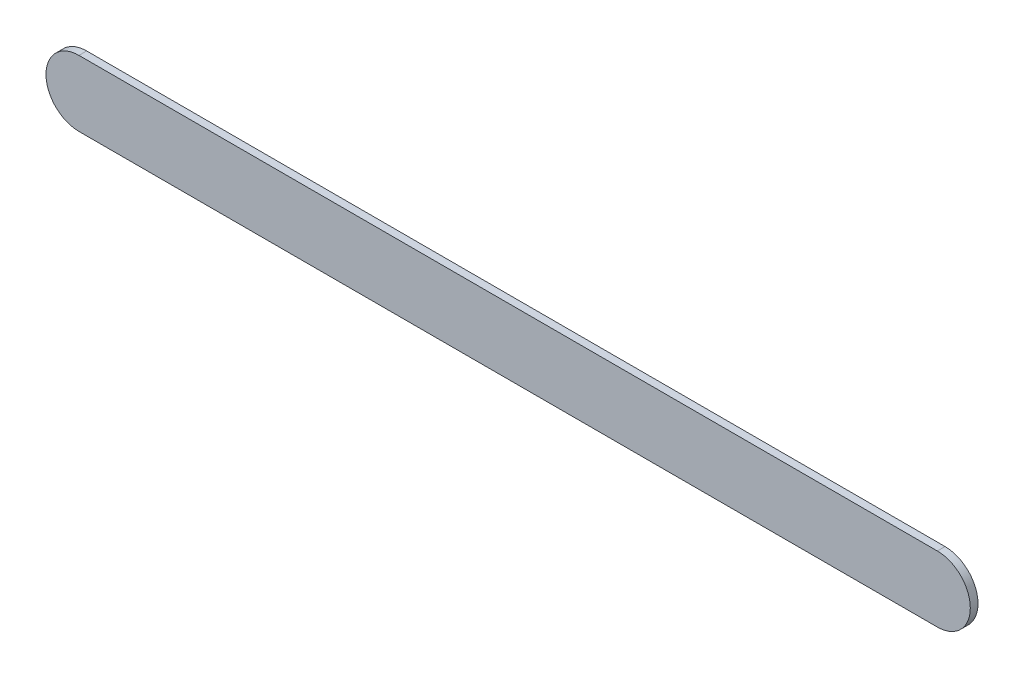
ISO-10303-21;
HEADER;
FILE_DESCRIPTION(('STEP AP214'),'2;1');
FILE_NAME('part.step','',(''),(''),'','','');
FILE_SCHEMA(('AUTOMOTIVE_DESIGN { 1 0 10303 214 1 1 1 1 }'));
ENDSEC;
DATA;
#1=APPLICATION_CONTEXT('core data for automotive mechanical design processes');
#2=APPLICATION_PROTOCOL_DEFINITION('international standard','automotive_design',2000,#1);
#3=PRODUCT_CONTEXT('',#1,'mechanical');
#4=PRODUCT('Part','Part','',(#3));
#5=PRODUCT_RELATED_PRODUCT_CATEGORY('part','',(#4));
#6=PRODUCT_DEFINITION_FORMATION('','',#4);
#7=PRODUCT_DEFINITION_CONTEXT('part definition',#1,'design');
#8=PRODUCT_DEFINITION('design','',#6,#7);
#9=PRODUCT_DEFINITION_SHAPE('','',#8);
#10=(LENGTH_UNIT() NAMED_UNIT(*) SI_UNIT(.MILLI.,.METRE.));
#11=(NAMED_UNIT(*) PLANE_ANGLE_UNIT() SI_UNIT($,.RADIAN.));
#12=(NAMED_UNIT(*) SI_UNIT($,.STERADIAN.) SOLID_ANGLE_UNIT());
#13=UNCERTAINTY_MEASURE_WITH_UNIT(LENGTH_MEASURE(1.E-05),#10,'distance_accuracy_value','');
#14=(GEOMETRIC_REPRESENTATION_CONTEXT(3) GLOBAL_UNCERTAINTY_ASSIGNED_CONTEXT((#13)) GLOBAL_UNIT_ASSIGNED_CONTEXT((#10,
#11,#12)) REPRESENTATION_CONTEXT('',''));
#15=CARTESIAN_POINT('',(0.,0.,0.));
#16=DIRECTION('',(0.,0.,1.));
#17=DIRECTION('',(1.,0.,0.));
#18=AXIS2_PLACEMENT_3D('',#15,#16,#17);
#19=CARTESIAN_POINT('',(131.4125,-67.65,1.635));
#20=DIRECTION('',(0.,0.,1.));
#21=DIRECTION('',(1.,0.,0.));
#22=AXIS2_PLACEMENT_3D('',#19,#20,#21);
#23=PLANE('',#22);
#24=DIRECTION('',(1.,0.,0.));
#25=VECTOR('',#24,1.);
#26=CARTESIAN_POINT('',(131.4125,-67.65,1.635));
#27=LINE('',#26,#25);
#28=CARTESIAN_POINT('',(131.4125,-67.65,1.635));
#29=VERTEX_POINT('',#28);
#30=CARTESIAN_POINT('',(135.32,-67.65,1.635));
#31=VERTEX_POINT('',#30);
#32=EDGE_CURVE('E84',#29,#31,#27,.T.);
#33=ORIENTED_EDGE('',*,*,#32,.T.);
#34=CARTESIAN_POINT('',(135.32,-67.5,1.635));
#35=DIRECTION('',(0.,0.,1.));
#36=DIRECTION('',(0.,-1.,0.));
#37=AXIS2_PLACEMENT_3D('',#34,#35,#36);
#38=CIRCLE('',#37,0.15);
#39=CARTESIAN_POINT('',(135.32,-67.35,1.635));
#40=VERTEX_POINT('',#39);
#41=EDGE_CURVE('E110',#31,#40,#38,.T.);
#42=ORIENTED_EDGE('',*,*,#41,.T.);
#43=DIRECTION('',(-1.,0.,0.));
#44=VECTOR('',#43,1.);
#45=CARTESIAN_POINT('',(135.32,-67.35,1.635));
#46=LINE('',#45,#44);
#47=CARTESIAN_POINT('',(131.4125,-67.35,1.635));
#48=VERTEX_POINT('',#47);
#49=EDGE_CURVE('E21',#40,#48,#46,.T.);
#50=ORIENTED_EDGE('',*,*,#49,.T.);
#51=CARTESIAN_POINT('',(131.4125,-67.5,1.635));
#52=DIRECTION('',(0.,0.,1.));
#53=DIRECTION('',(1.894780628694E-13,1.,0.));
#54=AXIS2_PLACEMENT_3D('',#51,#52,#53);
#55=CIRCLE('',#54,0.15);
#56=EDGE_CURVE('E11',#48,#29,#55,.T.);
#57=ORIENTED_EDGE('',*,*,#56,.T.);
#58=EDGE_LOOP('',(#33,#42,#50,#57));
#59=FACE_BOUND('',#58,.T.);
#60=ADVANCED_FACE('F17',(#59),#23,.T.);
#61=CARTESIAN_POINT('',(131.4125,-67.65,1.6));
#62=DIRECTION('',(0.,0.,1.));
#63=DIRECTION('',(1.,0.,0.));
#64=AXIS2_PLACEMENT_3D('',#61,#62,#63);
#65=PLANE('',#64);
#66=CARTESIAN_POINT('',(131.4125,-67.5,1.6));
#67=DIRECTION('',(0.,0.,1.));
#68=DIRECTION('',(1.894780628694E-13,1.,0.));
#69=AXIS2_PLACEMENT_3D('',#66,#67,#68);
#70=CIRCLE('',#69,0.15);
#71=CARTESIAN_POINT('',(131.4125,-67.35,1.6));
#72=VERTEX_POINT('',#71);
#73=CARTESIAN_POINT('',(131.4125,-67.65,1.6));
#74=VERTEX_POINT('',#73);
#75=EDGE_CURVE('E27',#72,#74,#70,.T.);
#76=ORIENTED_EDGE('',*,*,#75,.F.);
#77=DIRECTION('',(-1.,0.,0.));
#78=VECTOR('',#77,1.);
#79=CARTESIAN_POINT('',(135.32,-67.35,1.6));
#80=LINE('',#79,#78);
#81=CARTESIAN_POINT('',(135.32,-67.35,1.6));
#82=VERTEX_POINT('',#81);
#83=EDGE_CURVE('E106',#82,#72,#80,.T.);
#84=ORIENTED_EDGE('',*,*,#83,.F.);
#85=CARTESIAN_POINT('',(135.32,-67.5,1.6));
#86=DIRECTION('',(0.,0.,1.));
#87=DIRECTION('',(0.,-1.,0.));
#88=AXIS2_PLACEMENT_3D('',#85,#86,#87);
#89=CIRCLE('',#88,0.15);
#90=CARTESIAN_POINT('',(135.32,-67.65,1.6));
#91=VERTEX_POINT('',#90);
#92=EDGE_CURVE('E86',#91,#82,#89,.T.);
#93=ORIENTED_EDGE('',*,*,#92,.F.);
#94=DIRECTION('',(1.,0.,0.));
#95=VECTOR('',#94,1.);
#96=CARTESIAN_POINT('',(131.4125,-67.65,1.6));
#97=LINE('',#96,#95);
#98=EDGE_CURVE('E82',#74,#91,#97,.T.);
#99=ORIENTED_EDGE('',*,*,#98,.F.);
#100=EDGE_LOOP('',(#76,#84,#93,#99));
#101=FACE_BOUND('',#100,.T.);
#102=ADVANCED_FACE('F19',(#101),#65,.F.);
#103=CARTESIAN_POINT('',(131.4125,-67.5,1.6));
#104=DIRECTION('',(0.,0.,-1.));
#105=DIRECTION('',(1.894780628694E-13,1.,0.));
#106=AXIS2_PLACEMENT_3D('',#103,#104,#105);
#107=CYLINDRICAL_SURFACE('',#106,0.15);
#108=ORIENTED_EDGE('',*,*,#75,.T.);
#109=DIRECTION('',(0.,0.,1.));
#110=VECTOR('',#109,1.);
#111=CARTESIAN_POINT('',(131.4125,-67.65,1.6));
#112=LINE('',#111,#110);
#113=EDGE_CURVE('E71',#74,#29,#112,.T.);
#114=ORIENTED_EDGE('',*,*,#113,.T.);
#115=ORIENTED_EDGE('',*,*,#56,.F.);
#116=DIRECTION('',(0.,0.,1.));
#117=VECTOR('',#116,1.);
#118=CARTESIAN_POINT('',(131.4125,-67.35,1.6));
#119=LINE('',#118,#117);
#120=EDGE_CURVE('E74',#72,#48,#119,.T.);
#121=ORIENTED_EDGE('',*,*,#120,.F.);
#122=EDGE_LOOP('',(#108,#114,#115,#121));
#123=FACE_BOUND('',#122,.T.);
#124=ADVANCED_FACE('F70',(#123),#107,.T.);
#125=CARTESIAN_POINT('',(135.32,-67.35,1.6));
#126=DIRECTION('',(0.,-1.,0.));
#127=DIRECTION('',(0.,0.,-1.));
#128=AXIS2_PLACEMENT_3D('',#125,#126,#127);
#129=PLANE('',#128);
#130=ORIENTED_EDGE('',*,*,#83,.T.);
#131=ORIENTED_EDGE('',*,*,#120,.T.);
#132=ORIENTED_EDGE('',*,*,#49,.F.);
#133=DIRECTION('',(0.,0.,1.));
#134=VECTOR('',#133,1.);
#135=CARTESIAN_POINT('',(135.32,-67.35,1.6));
#136=LINE('',#135,#134);
#137=EDGE_CURVE('E103',#82,#40,#136,.T.);
#138=ORIENTED_EDGE('',*,*,#137,.F.);
#139=EDGE_LOOP('',(#130,#131,#132,#138));
#140=FACE_BOUND('',#139,.T.);
#141=ADVANCED_FACE('F118',(#140),#129,.F.);
#142=CARTESIAN_POINT('',(135.32,-67.5,1.6));
#143=DIRECTION('',(0.,0.,-1.));
#144=DIRECTION('',(0.,-1.,0.));
#145=AXIS2_PLACEMENT_3D('',#142,#143,#144);
#146=CYLINDRICAL_SURFACE('',#145,0.15);
#147=ORIENTED_EDGE('',*,*,#92,.T.);
#148=ORIENTED_EDGE('',*,*,#137,.T.);
#149=ORIENTED_EDGE('',*,*,#41,.F.);
#150=DIRECTION('',(0.,0.,1.));
#151=VECTOR('',#150,1.);
#152=CARTESIAN_POINT('',(135.32,-67.65,1.6));
#153=LINE('',#152,#151);
#154=EDGE_CURVE('E91',#91,#31,#153,.T.);
#155=ORIENTED_EDGE('',*,*,#154,.F.);
#156=EDGE_LOOP('',(#147,#148,#149,#155));
#157=FACE_BOUND('',#156,.T.);
#158=ADVANCED_FACE('F120',(#157),#146,.T.);
#159=CARTESIAN_POINT('',(131.4125,-67.65,1.6));
#160=DIRECTION('',(0.,1.,0.));
#161=DIRECTION('',(1.,0.,0.));
#162=AXIS2_PLACEMENT_3D('',#159,#160,#161);
#163=PLANE('',#162);
#164=ORIENTED_EDGE('',*,*,#98,.T.);
#165=ORIENTED_EDGE('',*,*,#154,.T.);
#166=ORIENTED_EDGE('',*,*,#32,.F.);
#167=ORIENTED_EDGE('',*,*,#113,.F.);
#168=EDGE_LOOP('',(#164,#165,#166,#167));
#169=FACE_BOUND('',#168,.T.);
#170=ADVANCED_FACE('F80',(#169),#163,.F.);
#171=CLOSED_SHELL('',(#60,#102,#124,#141,#158,#170));
#172=MANIFOLD_SOLID_BREP('B1',#171);
#173=ADVANCED_BREP_SHAPE_REPRESENTATION('',(#18,#172),#14);
#174=SHAPE_DEFINITION_REPRESENTATION(#9,#173);
ENDSEC;
END-ISO-10303-21;
